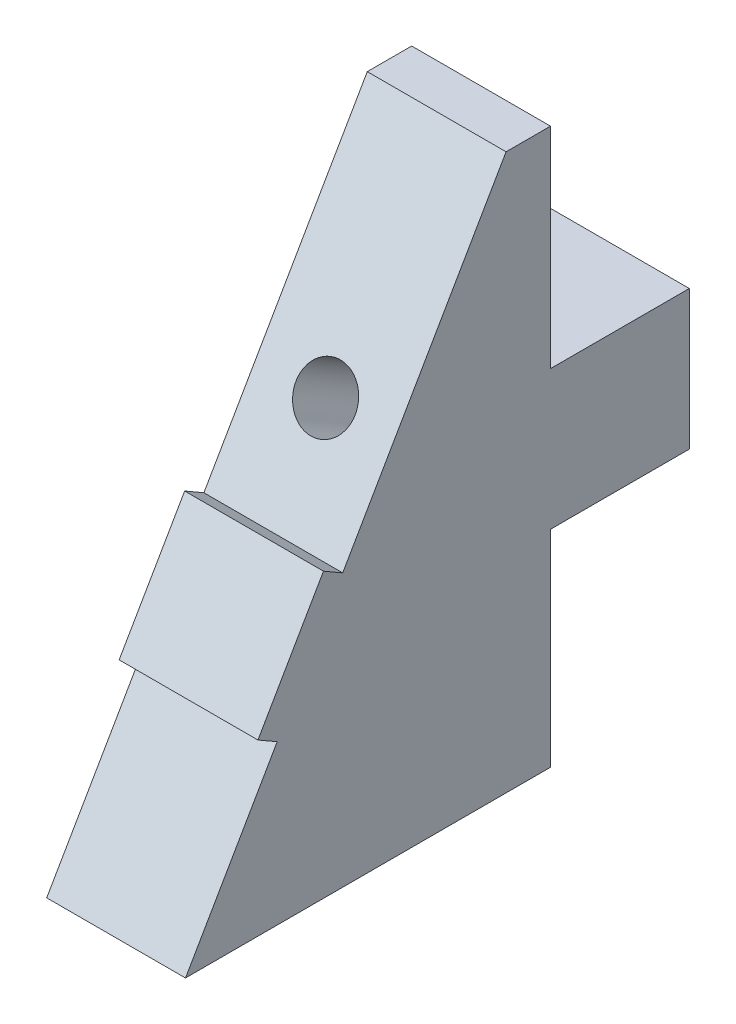
ISO-10303-21;
HEADER;
FILE_DESCRIPTION(('STEP AP214'),'2;1');
FILE_NAME('part.step','',(''),(''),'','','');
FILE_SCHEMA(('AUTOMOTIVE_DESIGN { 1 0 10303 214 1 1 1 1 }'));
ENDSEC;
DATA;
#1=APPLICATION_CONTEXT('core data for automotive mechanical design processes');
#2=APPLICATION_PROTOCOL_DEFINITION('international standard','automotive_design',2000,#1);
#3=PRODUCT_CONTEXT('',#1,'mechanical');
#4=PRODUCT('Part','Part','',(#3));
#5=PRODUCT_RELATED_PRODUCT_CATEGORY('part','',(#4));
#6=PRODUCT_DEFINITION_FORMATION('','',#4);
#7=PRODUCT_DEFINITION_CONTEXT('part definition',#1,'design');
#8=PRODUCT_DEFINITION('design','',#6,#7);
#9=PRODUCT_DEFINITION_SHAPE('','',#8);
#10=(LENGTH_UNIT() NAMED_UNIT(*) SI_UNIT(.MILLI.,.METRE.));
#11=(NAMED_UNIT(*) PLANE_ANGLE_UNIT() SI_UNIT($,.RADIAN.));
#12=(NAMED_UNIT(*) SI_UNIT($,.STERADIAN.) SOLID_ANGLE_UNIT());
#13=UNCERTAINTY_MEASURE_WITH_UNIT(LENGTH_MEASURE(1.E-05),#10,'distance_accuracy_value','');
#14=(GEOMETRIC_REPRESENTATION_CONTEXT(3) GLOBAL_UNCERTAINTY_ASSIGNED_CONTEXT((#13)) GLOBAL_UNIT_ASSIGNED_CONTEXT((#10,
#11,#12)) REPRESENTATION_CONTEXT('',''));
#15=CARTESIAN_POINT('',(0.,0.,0.));
#16=DIRECTION('',(0.,0.,1.));
#17=DIRECTION('',(1.,0.,0.));
#18=AXIS2_PLACEMENT_3D('',#15,#16,#17);
#19=CARTESIAN_POINT('',(0.,7.73788181024485,13.4024044383073));
#20=DIRECTION('',(0.,0.499999999999995,0.866025403784442));
#21=DIRECTION('',(0.,-0.866025403784442,0.499999999999995));
#22=AXIS2_PLACEMENT_3D('',#19,#20,#21);
#23=PLANE('',#22);
#24=DIRECTION('',(0.,-0.866025403784442,0.499999999999995));
#25=VECTOR('',#24,1.);
#26=CARTESIAN_POINT('',(0.,13.039728525167,10.3413818102449));
#27=LINE('',#26,#25);
#28=CARTESIAN_POINT('',(0.,12.9627388667705,10.3858318102449));
#29=VERTEX_POINT('',#28);
#30=CARTESIAN_POINT('',(0.,7.77143618632508,13.3830318102449));
#31=VERTEX_POINT('',#30);
#32=EDGE_CURVE('E176',#29,#31,#27,.T.);
#33=ORIENTED_EDGE('',*,*,#32,.T.);
#34=DIRECTION('',(-1.,0.,0.));
#35=VECTOR('',#34,1.);
#36=CARTESIAN_POINT('',(0.,7.77143618632508,13.3830318102449));
#37=LINE('',#36,#35);
#38=CARTESIAN_POINT('',(6.35,7.77143618632508,13.3830318102449));
#39=VERTEX_POINT('',#38);
#40=EDGE_CURVE('E163',#39,#31,#37,.T.);
#41=ORIENTED_EDGE('',*,*,#40,.F.);
#42=DIRECTION('',(0.,0.866025403784442,-0.499999999999995));
#43=VECTOR('',#42,1.);
#44=CARTESIAN_POINT('',(6.35,13.039728525167,10.3413818102449));
#45=LINE('',#44,#43);
#46=CARTESIAN_POINT('',(6.35,12.9627388667705,10.3858318102449));
#47=VERTEX_POINT('',#46);
#48=EDGE_CURVE('E180',#39,#47,#45,.T.);
#49=ORIENTED_EDGE('',*,*,#48,.T.);
#50=DIRECTION('',(1.,0.,0.));
#51=VECTOR('',#50,1.);
#52=CARTESIAN_POINT('',(0.,12.9627388667705,10.3858318102449));
#53=LINE('',#52,#51);
#54=EDGE_CURVE('E324',#29,#47,#53,.T.);
#55=ORIENTED_EDGE('',*,*,#54,.F.);
#56=EDGE_LOOP('',(#33,#41,#49,#55));
#57=FACE_BOUND('',#56,.T.);
#58=ADVANCED_FACE('F38',(#57),#23,.T.);
#59=CARTESIAN_POINT('',(0.,0.,-6.35));
#60=DIRECTION('',(0.,0.,1.));
#61=DIRECTION('',(1.,0.,0.));
#62=AXIS2_PLACEMENT_3D('',#59,#60,#61);
#63=PLANE('',#62);
#64=DIRECTION('',(0.,-1.,0.));
#65=VECTOR('',#64,1.);
#66=CARTESIAN_POINT('',(6.35,9.34719999999998,-6.35));
#67=LINE('',#66,#65);
#68=CARTESIAN_POINT('',(6.35,15.79372,-6.35));
#69=VERTEX_POINT('',#68);
#70=CARTESIAN_POINT('',(6.35,9.42847999999998,-6.35));
#71=VERTEX_POINT('',#70);
#72=EDGE_CURVE('E184',#69,#71,#67,.T.);
#73=ORIENTED_EDGE('',*,*,#72,.T.);
#74=DIRECTION('',(1.,0.,0.));
#75=VECTOR('',#74,1.);
#76=CARTESIAN_POINT('',(6.35,9.42847999999998,-6.35));
#77=LINE('',#76,#75);
#78=CARTESIAN_POINT('',(0.,9.42847999999998,-6.35));
#79=VERTEX_POINT('',#78);
#80=EDGE_CURVE('E204',#79,#71,#77,.T.);
#81=ORIENTED_EDGE('',*,*,#80,.F.);
#82=DIRECTION('',(0.,1.,0.));
#83=VECTOR('',#82,1.);
#84=CARTESIAN_POINT('',(0.,9.34719999999998,-6.35));
#85=LINE('',#84,#83);
#86=CARTESIAN_POINT('',(0.,15.79372,-6.35));
#87=VERTEX_POINT('',#86);
#88=EDGE_CURVE('E187',#79,#87,#85,.T.);
#89=ORIENTED_EDGE('',*,*,#88,.T.);
#90=DIRECTION('',(-1.,0.,0.));
#91=VECTOR('',#90,1.);
#92=CARTESIAN_POINT('',(0.,15.79372,-6.35));
#93=LINE('',#92,#91);
#94=EDGE_CURVE('E215',#69,#87,#93,.T.);
#95=ORIENTED_EDGE('',*,*,#94,.F.);
#96=EDGE_LOOP('',(#73,#81,#89,#95));
#97=FACE_BOUND('',#96,.T.);
#98=ADVANCED_FACE('F238',(#97),#63,.F.);
#99=CARTESIAN_POINT('',(6.35,25.4,2.032));
#100=DIRECTION('',(0.,-0.499999999999995,-0.866025403784442));
#101=DIRECTION('',(0.,0.866025403784442,-0.499999999999995));
#102=AXIS2_PLACEMENT_3D('',#99,#100,#101);
#103=PLANE('',#102);
#104=DIRECTION('',(0.,-0.866025403784442,0.499999999999995));
#105=VECTOR('',#104,1.);
#106=CARTESIAN_POINT('',(6.35,25.4,2.032));
#107=LINE('',#106,#105);
#108=CARTESIAN_POINT('',(6.35,7.26343618632508,12.5031499999999));
#109=VERTEX_POINT('',#108);
#110=CARTESIAN_POINT('',(6.35,0.,16.6966968374163));
#111=VERTEX_POINT('',#110);
#112=EDGE_CURVE('E156',#109,#111,#107,.T.);
#113=ORIENTED_EDGE('',*,*,#112,.F.);
#114=DIRECTION('',(1.,0.,0.));
#115=VECTOR('',#114,1.);
#116=CARTESIAN_POINT('',(0.,7.26343618632508,12.5031499999999));
#117=LINE('',#116,#115);
#118=CARTESIAN_POINT('',(0.,7.26343618632508,12.5031499999999));
#119=VERTEX_POINT('',#118);
#120=EDGE_CURVE('E154',#119,#109,#117,.T.);
#121=ORIENTED_EDGE('',*,*,#120,.F.);
#122=DIRECTION('',(0.,-0.866025403784442,0.499999999999995));
#123=VECTOR('',#122,1.);
#124=CARTESIAN_POINT('',(0.,25.4,2.032));
#125=LINE('',#124,#123);
#126=CARTESIAN_POINT('',(0.,0.,16.6966968374163));
#127=VERTEX_POINT('',#126);
#128=EDGE_CURVE('E137',#119,#127,#125,.T.);
#129=ORIENTED_EDGE('',*,*,#128,.T.);
#130=DIRECTION('',(-1.,0.,0.));
#131=VECTOR('',#130,1.);
#132=CARTESIAN_POINT('',(6.35,0.,16.6966968374163));
#133=LINE('',#132,#131);
#134=EDGE_CURVE('E304',#111,#127,#133,.T.);
#135=ORIENTED_EDGE('',*,*,#134,.F.);
#136=EDGE_LOOP('',(#113,#121,#129,#135));
#137=FACE_BOUND('',#136,.T.);
#138=ADVANCED_FACE('F155',(#137),#103,.F.);
#139=CARTESIAN_POINT('',(3.175,16.6011818975501,7.11199999999995));
#140=DIRECTION('',(0.,0.499999999999995,0.866025403784442));
#141=DIRECTION('',(0.,-0.866025403784442,0.499999999999995));
#142=AXIS2_PLACEMENT_3D('',#139,#140,#141);
#143=CIRCLE('',#142,1.35254999999999);
#144=CARTESIAN_POINT('',(3.175,15.4298392376614,7.78827499999993));
#145=VERTEX_POINT('',#144);
#146=EDGE_CURVE('E216',#145,#145,#143,.T.);
#147=ORIENTED_EDGE('',*,*,#146,.F.);
#148=EDGE_LOOP('',(#147));
#149=FACE_BOUND('',#148,.T.);
#150=CARTESIAN_POINT('',(0.,25.4,2.032));
#151=VERTEX_POINT('',#150);
#152=CARTESIAN_POINT('',(0.,12.4547388667705,9.50594999999992));
#153=VERTEX_POINT('',#152);
#154=EDGE_CURVE('E150',#151,#153,#125,.T.);
#155=ORIENTED_EDGE('',*,*,#154,.T.);
#156=DIRECTION('',(-1.,0.,0.));
#157=VECTOR('',#156,1.);
#158=CARTESIAN_POINT('',(0.,12.4547388667705,9.50594999999992));
#159=LINE('',#158,#157);
#160=CARTESIAN_POINT('',(6.35,12.4547388667705,9.50594999999992));
#161=VERTEX_POINT('',#160);
#162=EDGE_CURVE('E323',#161,#153,#159,.T.);
#163=ORIENTED_EDGE('',*,*,#162,.F.);
#164=CARTESIAN_POINT('',(6.35,25.4,2.032));
#165=VERTEX_POINT('',#164);
#166=EDGE_CURVE('E308',#165,#161,#107,.T.);
#167=ORIENTED_EDGE('',*,*,#166,.F.);
#168=DIRECTION('',(-1.,0.,0.));
#169=VECTOR('',#168,1.);
#170=CARTESIAN_POINT('',(6.35,25.4,2.032));
#171=LINE('',#170,#169);
#172=EDGE_CURVE('E307',#165,#151,#171,.T.);
#173=ORIENTED_EDGE('',*,*,#172,.T.);
#174=EDGE_LOOP('',(#155,#163,#167,#173));
#175=FACE_BOUND('',#174,.T.);
#176=ADVANCED_FACE('F256',(#149,#175),#103,.F.);
#177=CARTESIAN_POINT('',(6.35,0.,0.));
#178=DIRECTION('',(0.,0.,1.));
#179=DIRECTION('',(1.,0.,0.));
#180=AXIS2_PLACEMENT_3D('',#177,#178,#179);
#181=PLANE('',#180);
#182=DIRECTION('',(0.,1.,0.));
#183=VECTOR('',#182,1.);
#184=CARTESIAN_POINT('',(6.35,0.,0.));
#185=LINE('',#184,#183);
#186=CARTESIAN_POINT('',(6.35,15.79372,0.));
#187=VERTEX_POINT('',#186);
#188=CARTESIAN_POINT('',(6.35,25.4,0.));
#189=VERTEX_POINT('',#188);
#190=EDGE_CURVE('E42',#187,#189,#185,.T.);
#191=ORIENTED_EDGE('',*,*,#190,.F.);
#192=DIRECTION('',(1.,0.,0.));
#193=VECTOR('',#192,1.);
#194=CARTESIAN_POINT('',(0.,15.79372,0.));
#195=LINE('',#194,#193);
#196=CARTESIAN_POINT('',(0.,15.79372,0.));
#197=VERTEX_POINT('',#196);
#198=EDGE_CURVE('E212',#197,#187,#195,.T.);
#199=ORIENTED_EDGE('',*,*,#198,.F.);
#200=DIRECTION('',(0.,1.,0.));
#201=VECTOR('',#200,1.);
#202=CARTESIAN_POINT('',(0.,0.,0.));
#203=LINE('',#202,#201);
#204=CARTESIAN_POINT('',(0.,25.4,0.));
#205=VERTEX_POINT('',#204);
#206=EDGE_CURVE('E283',#197,#205,#203,.T.);
#207=ORIENTED_EDGE('',*,*,#206,.T.);
#208=DIRECTION('',(-1.,0.,0.));
#209=VECTOR('',#208,1.);
#210=CARTESIAN_POINT('',(6.35,25.4,0.));
#211=LINE('',#210,#209);
#212=EDGE_CURVE('E48',#189,#205,#211,.T.);
#213=ORIENTED_EDGE('',*,*,#212,.F.);
#214=EDGE_LOOP('',(#191,#199,#207,#213));
#215=FACE_BOUND('',#214,.T.);
#216=ADVANCED_FACE('F259',(#215),#181,.F.);
#217=CARTESIAN_POINT('',(0.,0.,0.));
#218=VERTEX_POINT('',#217);
#219=CARTESIAN_POINT('',(0.,9.42847999999998,0.));
#220=VERTEX_POINT('',#219);
#221=EDGE_CURVE('E286',#218,#220,#203,.T.);
#222=ORIENTED_EDGE('',*,*,#221,.T.);
#223=DIRECTION('',(-1.,0.,0.));
#224=VECTOR('',#223,1.);
#225=CARTESIAN_POINT('',(6.35,9.42847999999998,0.));
#226=LINE('',#225,#224);
#227=CARTESIAN_POINT('',(6.35,9.42847999999998,0.));
#228=VERTEX_POINT('',#227);
#229=EDGE_CURVE('E205',#228,#220,#226,.T.);
#230=ORIENTED_EDGE('',*,*,#229,.F.);
#231=CARTESIAN_POINT('',(6.35,0.,0.));
#232=VERTEX_POINT('',#231);
#233=EDGE_CURVE('E273',#232,#228,#185,.T.);
#234=ORIENTED_EDGE('',*,*,#233,.F.);
#235=DIRECTION('',(-1.,0.,0.));
#236=VECTOR('',#235,1.);
#237=CARTESIAN_POINT('',(6.35,0.,0.));
#238=LINE('',#237,#236);
#239=EDGE_CURVE('E12',#232,#218,#238,.T.);
#240=ORIENTED_EDGE('',*,*,#239,.T.);
#241=EDGE_LOOP('',(#222,#230,#234,#240));
#242=FACE_BOUND('',#241,.T.);
#243=ADVANCED_FACE('F261',(#242),#181,.F.);
#244=CARTESIAN_POINT('',(6.35,0.,16.6966968374163));
#245=DIRECTION('',(0.,1.,0.));
#246=DIRECTION('',(0.,0.,1.));
#247=AXIS2_PLACEMENT_3D('',#244,#245,#246);
#248=PLANE('',#247);
#249=DIRECTION('',(0.,0.,-1.));
#250=VECTOR('',#249,1.);
#251=CARTESIAN_POINT('',(0.,0.,16.6966968374163));
#252=LINE('',#251,#250);
#253=EDGE_CURVE('E145',#127,#218,#252,.T.);
#254=ORIENTED_EDGE('',*,*,#253,.T.);
#255=ORIENTED_EDGE('',*,*,#239,.F.);
#256=DIRECTION('',(0.,0.,-1.));
#257=VECTOR('',#256,1.);
#258=CARTESIAN_POINT('',(6.35,0.,16.6966968374163));
#259=LINE('',#258,#257);
#260=EDGE_CURVE('E191',#111,#232,#259,.T.);
#261=ORIENTED_EDGE('',*,*,#260,.F.);
#262=ORIENTED_EDGE('',*,*,#134,.T.);
#263=EDGE_LOOP('',(#254,#255,#261,#262));
#264=FACE_BOUND('',#263,.T.);
#265=ADVANCED_FACE('F40',(#264),#248,.F.);
#266=CARTESIAN_POINT('',(6.35,25.4,0.));
#267=DIRECTION('',(0.,-1.,0.));
#268=DIRECTION('',(0.,0.,-1.));
#269=AXIS2_PLACEMENT_3D('',#266,#267,#268);
#270=PLANE('',#269);
#271=DIRECTION('',(0.,0.,1.));
#272=VECTOR('',#271,1.);
#273=CARTESIAN_POINT('',(0.,25.4,0.));
#274=LINE('',#273,#272);
#275=EDGE_CURVE('E151',#205,#151,#274,.T.);
#276=ORIENTED_EDGE('',*,*,#275,.T.);
#277=ORIENTED_EDGE('',*,*,#172,.F.);
#278=DIRECTION('',(0.,0.,1.));
#279=VECTOR('',#278,1.);
#280=CARTESIAN_POINT('',(6.35,25.4,0.));
#281=LINE('',#280,#279);
#282=EDGE_CURVE('E312',#189,#165,#281,.T.);
#283=ORIENTED_EDGE('',*,*,#282,.F.);
#284=ORIENTED_EDGE('',*,*,#212,.T.);
#285=EDGE_LOOP('',(#276,#277,#283,#284));
#286=FACE_BOUND('',#285,.T.);
#287=ADVANCED_FACE('F250',(#286),#270,.F.);
#288=CARTESIAN_POINT('',(6.35,0.,0.));
#289=DIRECTION('',(1.,0.,0.));
#290=DIRECTION('',(0.,0.,-1.));
#291=AXIS2_PLACEMENT_3D('',#288,#289,#290);
#292=PLANE('',#291);
#293=DIRECTION('',(0.,0.499999999999995,0.866025403784441));
#294=VECTOR('',#293,1.);
#295=CARTESIAN_POINT('',(6.35,7.77143618632508,13.3830318102449));
#296=LINE('',#295,#294);
#297=EDGE_CURVE('E159',#109,#39,#296,.T.);
#298=ORIENTED_EDGE('',*,*,#297,.F.);
#299=ORIENTED_EDGE('',*,*,#112,.T.);
#300=ORIENTED_EDGE('',*,*,#260,.T.);
#301=ORIENTED_EDGE('',*,*,#233,.T.);
#302=DIRECTION('',(0.,0.,1.));
#303=VECTOR('',#302,1.);
#304=CARTESIAN_POINT('',(6.35,9.42847999999998,0.));
#305=LINE('',#304,#303);
#306=EDGE_CURVE('E278',#71,#228,#305,.T.);
#307=ORIENTED_EDGE('',*,*,#306,.F.);
#308=ORIENTED_EDGE('',*,*,#72,.F.);
#309=DIRECTION('',(0.,0.,-1.));
#310=VECTOR('',#309,1.);
#311=CARTESIAN_POINT('',(6.35,15.79372,-6.35));
#312=LINE('',#311,#310);
#313=EDGE_CURVE('E64',#187,#69,#312,.T.);
#314=ORIENTED_EDGE('',*,*,#313,.F.);
#315=ORIENTED_EDGE('',*,*,#190,.T.);
#316=ORIENTED_EDGE('',*,*,#282,.T.);
#317=ORIENTED_EDGE('',*,*,#166,.T.);
#318=DIRECTION('',(0.,-0.499999999999994,-0.866025403784442));
#319=VECTOR('',#318,1.);
#320=CARTESIAN_POINT('',(6.35,12.4547388667705,9.50594999999992));
#321=LINE('',#320,#319);
#322=EDGE_CURVE('E319',#47,#161,#321,.T.);
#323=ORIENTED_EDGE('',*,*,#322,.F.);
#324=ORIENTED_EDGE('',*,*,#48,.F.);
#325=EDGE_LOOP('',(#298,#299,#300,#301,#307,#308,#314,#315,#316,#317,#323,#324));
#326=FACE_BOUND('',#325,.T.);
#327=ADVANCED_FACE('F247',(#326),#292,.T.);
#328=CARTESIAN_POINT('',(0.,0.,0.));
#329=DIRECTION('',(1.,0.,0.));
#330=DIRECTION('',(0.,0.,-1.));
#331=AXIS2_PLACEMENT_3D('',#328,#329,#330);
#332=PLANE('',#331);
#333=ORIENTED_EDGE('',*,*,#128,.F.);
#334=DIRECTION('',(0.,-0.499999999999995,-0.866025403784441));
#335=VECTOR('',#334,1.);
#336=CARTESIAN_POINT('',(0.,7.77143618632508,13.3830318102449));
#337=LINE('',#336,#335);
#338=EDGE_CURVE('E142',#31,#119,#337,.T.);
#339=ORIENTED_EDGE('',*,*,#338,.F.);
#340=ORIENTED_EDGE('',*,*,#32,.F.);
#341=DIRECTION('',(0.,0.499999999999994,0.866025403784442));
#342=VECTOR('',#341,1.);
#343=CARTESIAN_POINT('',(0.,12.4547388667705,9.50594999999992));
#344=LINE('',#343,#342);
#345=EDGE_CURVE('E56',#153,#29,#344,.T.);
#346=ORIENTED_EDGE('',*,*,#345,.F.);
#347=ORIENTED_EDGE('',*,*,#154,.F.);
#348=ORIENTED_EDGE('',*,*,#275,.F.);
#349=ORIENTED_EDGE('',*,*,#206,.F.);
#350=DIRECTION('',(0.,0.,1.));
#351=VECTOR('',#350,1.);
#352=CARTESIAN_POINT('',(0.,15.79372,-6.35));
#353=LINE('',#352,#351);
#354=EDGE_CURVE('E207',#87,#197,#353,.T.);
#355=ORIENTED_EDGE('',*,*,#354,.F.);
#356=ORIENTED_EDGE('',*,*,#88,.F.);
#357=DIRECTION('',(0.,0.,-1.));
#358=VECTOR('',#357,1.);
#359=CARTESIAN_POINT('',(0.,9.42847999999998,0.));
#360=LINE('',#359,#358);
#361=EDGE_CURVE('E199',#220,#79,#360,.T.);
#362=ORIENTED_EDGE('',*,*,#361,.F.);
#363=ORIENTED_EDGE('',*,*,#221,.F.);
#364=ORIENTED_EDGE('',*,*,#253,.F.);
#365=EDGE_LOOP('',(#333,#339,#340,#346,#347,#348,#349,#355,#356,#362,#363,#364));
#366=FACE_BOUND('',#365,.T.);
#367=ADVANCED_FACE('F139',(#366),#332,.F.);
#368=CARTESIAN_POINT('',(3.175,13.4261818975501,1.61273868596875));
#369=DIRECTION('',(0.,0.499999999999995,0.866025403784442));
#370=DIRECTION('',(0.,-0.866025403784442,0.499999999999995));
#371=AXIS2_PLACEMENT_3D('',#368,#369,#370);
#372=CONICAL_SURFACE('',#371,1.35254999999999,1.02974425867665);
#373=CARTESIAN_POINT('',(3.175,13.0198348824172,0.908925010254667));
#374=VERTEX_POINT('',#373);
#375=VERTEX_LOOP('',#374);
#376=FACE_BOUND('',#375,.T.);
#377=CARTESIAN_POINT('',(3.175,13.4261818975501,1.61273868596875));
#378=DIRECTION('',(0.,0.499999999999995,0.866025403784442));
#379=DIRECTION('',(0.,-0.866025403784442,0.499999999999995));
#380=AXIS2_PLACEMENT_3D('',#377,#378,#379);
#381=CIRCLE('',#380,1.35254999999999);
#382=CARTESIAN_POINT('',(3.175,12.2548392376615,2.28901368596873));
#383=VERTEX_POINT('',#382);
#384=EDGE_CURVE('E181',#383,#383,#381,.T.);
#385=ORIENTED_EDGE('',*,*,#384,.T.);
#386=EDGE_LOOP('',(#385));
#387=FACE_BOUND('',#386,.T.);
#388=ADVANCED_FACE('F223',(#376,#387),#372,.F.);
#389=CARTESIAN_POINT('',(3.175,16.6011818975501,7.11199999999995));
#390=DIRECTION('',(0.,0.499999999999995,0.866025403784442));
#391=DIRECTION('',(0.,-0.866025403784442,0.499999999999995));
#392=AXIS2_PLACEMENT_3D('',#389,#390,#391);
#393=CYLINDRICAL_SURFACE('',#392,1.35254999999999);
#394=ORIENTED_EDGE('',*,*,#384,.F.);
#395=EDGE_LOOP('',(#394));
#396=FACE_BOUND('',#395,.T.);
#397=ORIENTED_EDGE('',*,*,#146,.T.);
#398=EDGE_LOOP('',(#397));
#399=FACE_BOUND('',#398,.T.);
#400=ADVANCED_FACE('F225',(#396,#399),#393,.F.);
#401=CARTESIAN_POINT('',(0.,15.79372,0.));
#402=DIRECTION('',(0.,1.,0.));
#403=DIRECTION('',(0.,0.,1.));
#404=AXIS2_PLACEMENT_3D('',#401,#402,#403);
#405=PLANE('',#404);
#406=ORIENTED_EDGE('',*,*,#354,.T.);
#407=ORIENTED_EDGE('',*,*,#198,.T.);
#408=ORIENTED_EDGE('',*,*,#313,.T.);
#409=ORIENTED_EDGE('',*,*,#94,.T.);
#410=EDGE_LOOP('',(#406,#407,#408,#409));
#411=FACE_BOUND('',#410,.T.);
#412=ADVANCED_FACE('F227',(#411),#405,.T.);
#413=CARTESIAN_POINT('',(0.,9.42847999999998,0.));
#414=DIRECTION('',(0.,1.,0.));
#415=DIRECTION('',(0.,0.,1.));
#416=AXIS2_PLACEMENT_3D('',#413,#414,#415);
#417=PLANE('',#416);
#418=ORIENTED_EDGE('',*,*,#306,.T.);
#419=ORIENTED_EDGE('',*,*,#229,.T.);
#420=ORIENTED_EDGE('',*,*,#361,.T.);
#421=ORIENTED_EDGE('',*,*,#80,.T.);
#422=EDGE_LOOP('',(#418,#419,#420,#421));
#423=FACE_BOUND('',#422,.T.);
#424=ADVANCED_FACE('F233',(#423),#417,.F.);
#425=CARTESIAN_POINT('',(0.,5.2248570565257,-3.01657262806238));
#426=DIRECTION('',(0.,0.866025403784442,-0.499999999999994));
#427=DIRECTION('',(0.,0.499999999999994,0.866025403784442));
#428=AXIS2_PLACEMENT_3D('',#425,#426,#427);
#429=PLANE('',#428);
#430=ORIENTED_EDGE('',*,*,#345,.T.);
#431=ORIENTED_EDGE('',*,*,#54,.T.);
#432=ORIENTED_EDGE('',*,*,#322,.T.);
#433=ORIENTED_EDGE('',*,*,#162,.T.);
#434=EDGE_LOOP('',(#430,#431,#432,#433));
#435=FACE_BOUND('',#434,.T.);
#436=ADVANCED_FACE('F322',(#435),#429,.T.);
#437=CARTESIAN_POINT('',(0.,0.0335543760802308,-0.0193726280624109));
#438=DIRECTION('',(0.,-0.866025403784442,0.499999999999995));
#439=DIRECTION('',(0.,-0.499999999999995,-0.866025403784442));
#440=AXIS2_PLACEMENT_3D('',#437,#438,#439);
#441=PLANE('',#440);
#442=ORIENTED_EDGE('',*,*,#338,.T.);
#443=ORIENTED_EDGE('',*,*,#120,.T.);
#444=ORIENTED_EDGE('',*,*,#297,.T.);
#445=ORIENTED_EDGE('',*,*,#40,.T.);
#446=EDGE_LOOP('',(#442,#443,#444,#445));
#447=FACE_BOUND('',#446,.T.);
#448=ADVANCED_FACE('F161',(#447),#441,.T.);
#449=CLOSED_SHELL('',(#58,#98,#138,#176,#216,#243,#265,#287,#327,#367,#388,#400,#412,#424,#436,#448));
#450=MANIFOLD_SOLID_BREP('B2',#449);
#451=ADVANCED_BREP_SHAPE_REPRESENTATION('',(#18,#450),#14);
#452=SHAPE_DEFINITION_REPRESENTATION(#9,#451);
ENDSEC;
END-ISO-10303-21;
